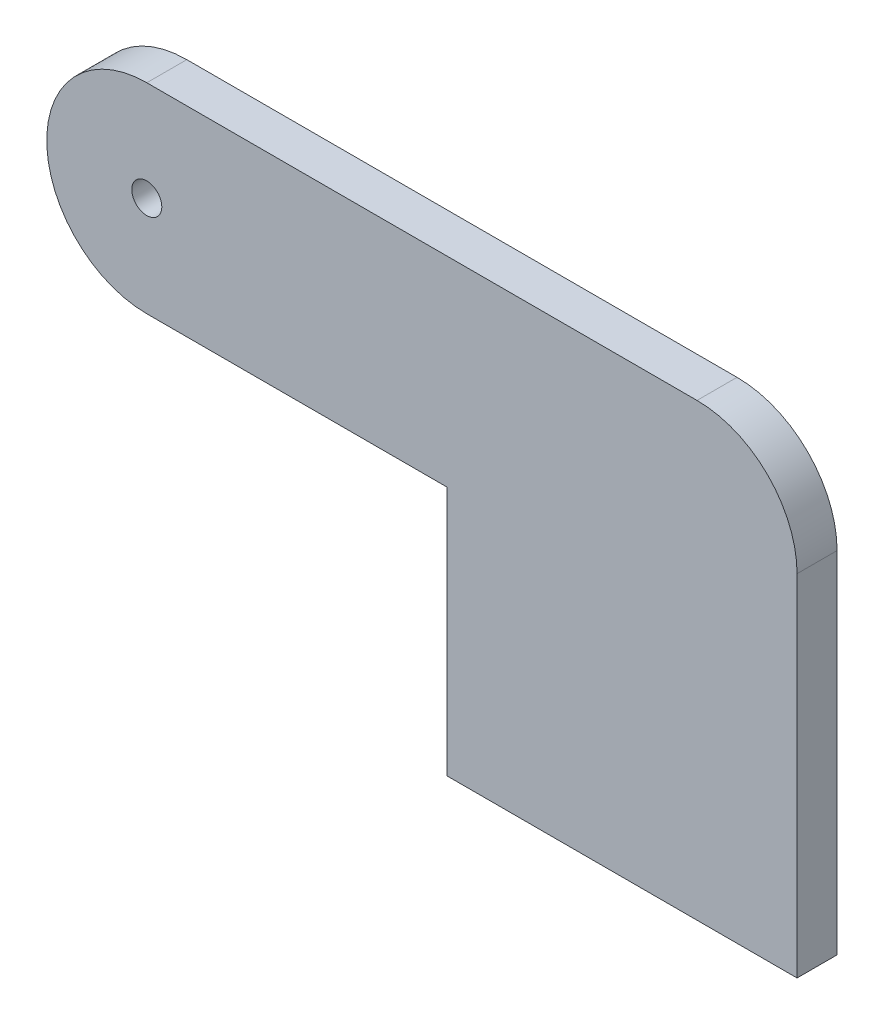
ISO-10303-21;
HEADER;
FILE_DESCRIPTION(('STEP AP214'),'2;1');
FILE_NAME('part.step','',(''),(''),'','','');
FILE_SCHEMA(('AUTOMOTIVE_DESIGN { 1 0 10303 214 1 1 1 1 }'));
ENDSEC;
DATA;
#1=APPLICATION_CONTEXT('core data for automotive mechanical design processes');
#2=APPLICATION_PROTOCOL_DEFINITION('international standard','automotive_design',2000,#1);
#3=PRODUCT_CONTEXT('',#1,'mechanical');
#4=PRODUCT('Part','Part','',(#3));
#5=PRODUCT_RELATED_PRODUCT_CATEGORY('part','',(#4));
#6=PRODUCT_DEFINITION_FORMATION('','',#4);
#7=PRODUCT_DEFINITION_CONTEXT('part definition',#1,'design');
#8=PRODUCT_DEFINITION('design','',#6,#7);
#9=PRODUCT_DEFINITION_SHAPE('','',#8);
#10=(LENGTH_UNIT() NAMED_UNIT(*) SI_UNIT(.MILLI.,.METRE.));
#11=(NAMED_UNIT(*) PLANE_ANGLE_UNIT() SI_UNIT($,.RADIAN.));
#12=(NAMED_UNIT(*) SI_UNIT($,.STERADIAN.) SOLID_ANGLE_UNIT());
#13=UNCERTAINTY_MEASURE_WITH_UNIT(LENGTH_MEASURE(1.E-05),#10,'distance_accuracy_value','');
#14=(GEOMETRIC_REPRESENTATION_CONTEXT(3) GLOBAL_UNCERTAINTY_ASSIGNED_CONTEXT((#13)) GLOBAL_UNIT_ASSIGNED_CONTEXT((#10,
#11,#12)) REPRESENTATION_CONTEXT('',''));
#15=CARTESIAN_POINT('',(0.,0.,0.));
#16=DIRECTION('',(0.,0.,1.));
#17=DIRECTION('',(1.,0.,0.));
#18=AXIS2_PLACEMENT_3D('',#15,#16,#17);
#19=CARTESIAN_POINT('',(0.,0.,4.));
#20=DIRECTION('',(0.,0.,1.));
#21=DIRECTION('',(1.,0.,0.));
#22=AXIS2_PLACEMENT_3D('',#19,#20,#21);
#23=PLANE('',#22);
#24=CARTESIAN_POINT('',(0.,0.,4.));
#25=DIRECTION('',(0.,0.,1.));
#26=DIRECTION('',(1.,0.,0.));
#27=AXIS2_PLACEMENT_3D('',#24,#25,#26);
#28=CIRCLE('',#27,10.);
#29=CARTESIAN_POINT('',(0.,10.,4.));
#30=VERTEX_POINT('',#29);
#31=CARTESIAN_POINT('',(0.,-10.,4.));
#32=VERTEX_POINT('',#31);
#33=EDGE_CURVE('E147',#30,#32,#28,.T.);
#34=ORIENTED_EDGE('',*,*,#33,.T.);
#35=DIRECTION('',(1.,0.,0.));
#36=VECTOR('',#35,1.);
#37=CARTESIAN_POINT('',(0.,-10.,4.));
#38=LINE('',#37,#36);
#39=CARTESIAN_POINT('',(30.,-10.,4.));
#40=VERTEX_POINT('',#39);
#41=EDGE_CURVE('E100',#32,#40,#38,.T.);
#42=ORIENTED_EDGE('',*,*,#41,.T.);
#43=DIRECTION('',(0.,-1.,0.));
#44=VECTOR('',#43,1.);
#45=CARTESIAN_POINT('',(30.,-10.,4.));
#46=LINE('',#45,#44);
#47=CARTESIAN_POINT('',(30.,-35.,4.));
#48=VERTEX_POINT('',#47);
#49=EDGE_CURVE('E159',#40,#48,#46,.T.);
#50=ORIENTED_EDGE('',*,*,#49,.T.);
#51=DIRECTION('',(1.,0.,0.));
#52=VECTOR('',#51,1.);
#53=CARTESIAN_POINT('',(30.,-35.,4.));
#54=LINE('',#53,#52);
#55=CARTESIAN_POINT('',(65.,-35.,4.));
#56=VERTEX_POINT('',#55);
#57=EDGE_CURVE('E116',#48,#56,#54,.T.);
#58=ORIENTED_EDGE('',*,*,#57,.T.);
#59=DIRECTION('',(0.,1.,0.));
#60=VECTOR('',#59,1.);
#61=CARTESIAN_POINT('',(65.,0.,4.));
#62=LINE('',#61,#60);
#63=CARTESIAN_POINT('',(65.,0.,4.));
#64=VERTEX_POINT('',#63);
#65=EDGE_CURVE('E110',#56,#64,#62,.T.);
#66=ORIENTED_EDGE('',*,*,#65,.T.);
#67=CARTESIAN_POINT('',(55.,0.,4.));
#68=DIRECTION('',(0.,0.,1.));
#69=DIRECTION('',(1.,0.,0.));
#70=AXIS2_PLACEMENT_3D('',#67,#68,#69);
#71=CIRCLE('',#70,10.);
#72=CARTESIAN_POINT('',(55.,10.,4.));
#73=VERTEX_POINT('',#72);
#74=EDGE_CURVE('E114',#64,#73,#71,.T.);
#75=ORIENTED_EDGE('',*,*,#74,.T.);
#76=DIRECTION('',(-1.,0.,0.));
#77=VECTOR('',#76,1.);
#78=CARTESIAN_POINT('',(0.,10.,4.));
#79=LINE('',#78,#77);
#80=EDGE_CURVE('E60',#73,#30,#79,.T.);
#81=ORIENTED_EDGE('',*,*,#80,.T.);
#82=EDGE_LOOP('',(#34,#42,#50,#58,#66,#75,#81));
#83=FACE_BOUND('',#82,.T.);
#84=CARTESIAN_POINT('',(0.,0.,4.));
#85=DIRECTION('',(0.,0.,1.));
#86=DIRECTION('',(1.,0.,0.));
#87=AXIS2_PLACEMENT_3D('',#84,#85,#86);
#88=CIRCLE('',#87,1.5);
#89=CARTESIAN_POINT('',(1.5,0.,4.));
#90=VERTEX_POINT('',#89);
#91=EDGE_CURVE('E138',#90,#90,#88,.T.);
#92=ORIENTED_EDGE('',*,*,#91,.F.);
#93=EDGE_LOOP('',(#92));
#94=FACE_BOUND('',#93,.T.);
#95=ADVANCED_FACE('F43',(#83,#94),#23,.T.);
#96=CARTESIAN_POINT('',(0.,0.,0.));
#97=DIRECTION('',(0.,0.,1.));
#98=DIRECTION('',(1.,0.,0.));
#99=AXIS2_PLACEMENT_3D('',#96,#97,#98);
#100=PLANE('',#99);
#101=CARTESIAN_POINT('',(0.,0.,0.));
#102=DIRECTION('',(0.,0.,1.));
#103=DIRECTION('',(1.,0.,0.));
#104=AXIS2_PLACEMENT_3D('',#101,#102,#103);
#105=CIRCLE('',#104,10.);
#106=CARTESIAN_POINT('',(0.,10.,0.));
#107=VERTEX_POINT('',#106);
#108=CARTESIAN_POINT('',(0.,-10.,0.));
#109=VERTEX_POINT('',#108);
#110=EDGE_CURVE('E134',#107,#109,#105,.T.);
#111=ORIENTED_EDGE('',*,*,#110,.F.);
#112=DIRECTION('',(-1.,0.,0.));
#113=VECTOR('',#112,1.);
#114=CARTESIAN_POINT('',(0.,10.,0.));
#115=LINE('',#114,#113);
#116=CARTESIAN_POINT('',(55.,10.,0.));
#117=VERTEX_POINT('',#116);
#118=EDGE_CURVE('E92',#117,#107,#115,.T.);
#119=ORIENTED_EDGE('',*,*,#118,.F.);
#120=CARTESIAN_POINT('',(55.,0.,0.));
#121=DIRECTION('',(0.,0.,1.));
#122=DIRECTION('',(1.,0.,0.));
#123=AXIS2_PLACEMENT_3D('',#120,#121,#122);
#124=CIRCLE('',#123,10.);
#125=CARTESIAN_POINT('',(65.,0.,0.));
#126=VERTEX_POINT('',#125);
#127=EDGE_CURVE('E86',#126,#117,#124,.T.);
#128=ORIENTED_EDGE('',*,*,#127,.F.);
#129=DIRECTION('',(0.,1.,0.));
#130=VECTOR('',#129,1.);
#131=CARTESIAN_POINT('',(65.,0.,0.));
#132=LINE('',#131,#130);
#133=CARTESIAN_POINT('',(65.,-35.,0.));
#134=VERTEX_POINT('',#133);
#135=EDGE_CURVE('E124',#134,#126,#132,.T.);
#136=ORIENTED_EDGE('',*,*,#135,.F.);
#137=DIRECTION('',(1.,0.,0.));
#138=VECTOR('',#137,1.);
#139=CARTESIAN_POINT('',(30.,-35.,0.));
#140=LINE('',#139,#138);
#141=CARTESIAN_POINT('',(30.,-35.,0.));
#142=VERTEX_POINT('',#141);
#143=EDGE_CURVE('E142',#142,#134,#140,.T.);
#144=ORIENTED_EDGE('',*,*,#143,.F.);
#145=DIRECTION('',(0.,-1.,0.));
#146=VECTOR('',#145,1.);
#147=CARTESIAN_POINT('',(30.,-10.,0.));
#148=LINE('',#147,#146);
#149=CARTESIAN_POINT('',(30.,-10.,0.));
#150=VERTEX_POINT('',#149);
#151=EDGE_CURVE('E140',#150,#142,#148,.T.);
#152=ORIENTED_EDGE('',*,*,#151,.F.);
#153=DIRECTION('',(1.,0.,0.));
#154=VECTOR('',#153,1.);
#155=CARTESIAN_POINT('',(0.,-10.,0.));
#156=LINE('',#155,#154);
#157=EDGE_CURVE('E137',#109,#150,#156,.T.);
#158=ORIENTED_EDGE('',*,*,#157,.F.);
#159=EDGE_LOOP('',(#111,#119,#128,#136,#144,#152,#158));
#160=FACE_BOUND('',#159,.T.);
#161=CARTESIAN_POINT('',(0.,0.,0.));
#162=DIRECTION('',(0.,0.,1.));
#163=DIRECTION('',(1.,0.,0.));
#164=AXIS2_PLACEMENT_3D('',#161,#162,#163);
#165=CIRCLE('',#164,1.5);
#166=CARTESIAN_POINT('',(1.5,0.,0.));
#167=VERTEX_POINT('',#166);
#168=EDGE_CURVE('E171',#167,#167,#165,.T.);
#169=ORIENTED_EDGE('',*,*,#168,.T.);
#170=EDGE_LOOP('',(#169));
#171=FACE_BOUND('',#170,.T.);
#172=ADVANCED_FACE('F163',(#160,#171),#100,.F.);
#173=CARTESIAN_POINT('',(0.,0.,4.));
#174=DIRECTION('',(0.,0.,-1.));
#175=DIRECTION('',(-1.,0.,0.));
#176=AXIS2_PLACEMENT_3D('',#173,#174,#175);
#177=CYLINDRICAL_SURFACE('',#176,10.);
#178=ORIENTED_EDGE('',*,*,#110,.T.);
#179=DIRECTION('',(0.,0.,-1.));
#180=VECTOR('',#179,1.);
#181=CARTESIAN_POINT('',(0.,-10.,4.));
#182=LINE('',#181,#180);
#183=EDGE_CURVE('E13',#32,#109,#182,.T.);
#184=ORIENTED_EDGE('',*,*,#183,.F.);
#185=ORIENTED_EDGE('',*,*,#33,.F.);
#186=DIRECTION('',(0.,0.,-1.));
#187=VECTOR('',#186,1.);
#188=CARTESIAN_POINT('',(0.,10.,4.));
#189=LINE('',#188,#187);
#190=EDGE_CURVE('E130',#30,#107,#189,.T.);
#191=ORIENTED_EDGE('',*,*,#190,.T.);
#192=EDGE_LOOP('',(#178,#184,#185,#191));
#193=FACE_BOUND('',#192,.T.);
#194=ADVANCED_FACE('F45',(#193),#177,.T.);
#195=CARTESIAN_POINT('',(0.,-10.,4.));
#196=DIRECTION('',(0.,1.,0.));
#197=DIRECTION('',(0.,0.,1.));
#198=AXIS2_PLACEMENT_3D('',#195,#196,#197);
#199=PLANE('',#198);
#200=ORIENTED_EDGE('',*,*,#157,.T.);
#201=DIRECTION('',(0.,0.,-1.));
#202=VECTOR('',#201,1.);
#203=CARTESIAN_POINT('',(30.,-10.,4.));
#204=LINE('',#203,#202);
#205=EDGE_CURVE('E52',#40,#150,#204,.T.);
#206=ORIENTED_EDGE('',*,*,#205,.F.);
#207=ORIENTED_EDGE('',*,*,#41,.F.);
#208=ORIENTED_EDGE('',*,*,#183,.T.);
#209=EDGE_LOOP('',(#200,#206,#207,#208));
#210=FACE_BOUND('',#209,.T.);
#211=ADVANCED_FACE('F197',(#210),#199,.F.);
#212=CARTESIAN_POINT('',(30.,-10.,4.));
#213=DIRECTION('',(1.,0.,0.));
#214=DIRECTION('',(0.,1.,0.));
#215=AXIS2_PLACEMENT_3D('',#212,#213,#214);
#216=PLANE('',#215);
#217=ORIENTED_EDGE('',*,*,#151,.T.);
#218=DIRECTION('',(0.,0.,-1.));
#219=VECTOR('',#218,1.);
#220=CARTESIAN_POINT('',(30.,-35.,4.));
#221=LINE('',#220,#219);
#222=EDGE_CURVE('E151',#48,#142,#221,.T.);
#223=ORIENTED_EDGE('',*,*,#222,.F.);
#224=ORIENTED_EDGE('',*,*,#49,.F.);
#225=ORIENTED_EDGE('',*,*,#205,.T.);
#226=EDGE_LOOP('',(#217,#223,#224,#225));
#227=FACE_BOUND('',#226,.T.);
#228=ADVANCED_FACE('F157',(#227),#216,.F.);
#229=CARTESIAN_POINT('',(30.,-35.,4.));
#230=DIRECTION('',(0.,1.,0.));
#231=DIRECTION('',(0.,0.,1.));
#232=AXIS2_PLACEMENT_3D('',#229,#230,#231);
#233=PLANE('',#232);
#234=ORIENTED_EDGE('',*,*,#143,.T.);
#235=DIRECTION('',(0.,0.,-1.));
#236=VECTOR('',#235,1.);
#237=CARTESIAN_POINT('',(65.,-35.,4.));
#238=LINE('',#237,#236);
#239=EDGE_CURVE('E125',#56,#134,#238,.T.);
#240=ORIENTED_EDGE('',*,*,#239,.F.);
#241=ORIENTED_EDGE('',*,*,#57,.F.);
#242=ORIENTED_EDGE('',*,*,#222,.T.);
#243=EDGE_LOOP('',(#234,#240,#241,#242));
#244=FACE_BOUND('',#243,.T.);
#245=ADVANCED_FACE('F166',(#244),#233,.F.);
#246=CARTESIAN_POINT('',(65.,0.,4.));
#247=DIRECTION('',(-1.,0.,0.));
#248=DIRECTION('',(0.,-1.,0.));
#249=AXIS2_PLACEMENT_3D('',#246,#247,#248);
#250=PLANE('',#249);
#251=ORIENTED_EDGE('',*,*,#135,.T.);
#252=DIRECTION('',(0.,0.,-1.));
#253=VECTOR('',#252,1.);
#254=CARTESIAN_POINT('',(65.,0.,4.));
#255=LINE('',#254,#253);
#256=EDGE_CURVE('E121',#64,#126,#255,.T.);
#257=ORIENTED_EDGE('',*,*,#256,.F.);
#258=ORIENTED_EDGE('',*,*,#65,.F.);
#259=ORIENTED_EDGE('',*,*,#239,.T.);
#260=EDGE_LOOP('',(#251,#257,#258,#259));
#261=FACE_BOUND('',#260,.T.);
#262=ADVANCED_FACE('F122',(#261),#250,.F.);
#263=CARTESIAN_POINT('',(55.,0.,4.));
#264=DIRECTION('',(0.,0.,-1.));
#265=DIRECTION('',(-1.,0.,0.));
#266=AXIS2_PLACEMENT_3D('',#263,#264,#265);
#267=CYLINDRICAL_SURFACE('',#266,10.);
#268=ORIENTED_EDGE('',*,*,#127,.T.);
#269=DIRECTION('',(0.,0.,-1.));
#270=VECTOR('',#269,1.);
#271=CARTESIAN_POINT('',(55.,10.,4.));
#272=LINE('',#271,#270);
#273=EDGE_CURVE('E126',#73,#117,#272,.T.);
#274=ORIENTED_EDGE('',*,*,#273,.F.);
#275=ORIENTED_EDGE('',*,*,#74,.F.);
#276=ORIENTED_EDGE('',*,*,#256,.T.);
#277=EDGE_LOOP('',(#268,#274,#275,#276));
#278=FACE_BOUND('',#277,.T.);
#279=ADVANCED_FACE('F128',(#278),#267,.T.);
#280=CARTESIAN_POINT('',(0.,10.,4.));
#281=DIRECTION('',(0.,-1.,0.));
#282=DIRECTION('',(1.,0.,0.));
#283=AXIS2_PLACEMENT_3D('',#280,#281,#282);
#284=PLANE('',#283);
#285=ORIENTED_EDGE('',*,*,#118,.T.);
#286=ORIENTED_EDGE('',*,*,#190,.F.);
#287=ORIENTED_EDGE('',*,*,#80,.F.);
#288=ORIENTED_EDGE('',*,*,#273,.T.);
#289=EDGE_LOOP('',(#285,#286,#287,#288));
#290=FACE_BOUND('',#289,.T.);
#291=ADVANCED_FACE('F187',(#290),#284,.F.);
#292=CARTESIAN_POINT('',(0.,0.,4.));
#293=DIRECTION('',(0.,0.,-1.));
#294=DIRECTION('',(-1.,0.,0.));
#295=AXIS2_PLACEMENT_3D('',#292,#293,#294);
#296=CYLINDRICAL_SURFACE('',#295,1.5);
#297=ORIENTED_EDGE('',*,*,#91,.T.);
#298=EDGE_LOOP('',(#297));
#299=FACE_BOUND('',#298,.T.);
#300=ORIENTED_EDGE('',*,*,#168,.F.);
#301=EDGE_LOOP('',(#300));
#302=FACE_BOUND('',#301,.T.);
#303=ADVANCED_FACE('F177',(#299,#302),#296,.F.);
#304=CLOSED_SHELL('',(#95,#172,#194,#211,#228,#245,#262,#279,#291,#303));
#305=MANIFOLD_SOLID_BREP('B2',#304);
#306=ADVANCED_BREP_SHAPE_REPRESENTATION('',(#18,#305),#14);
#307=SHAPE_DEFINITION_REPRESENTATION(#9,#306);
ENDSEC;
END-ISO-10303-21;
